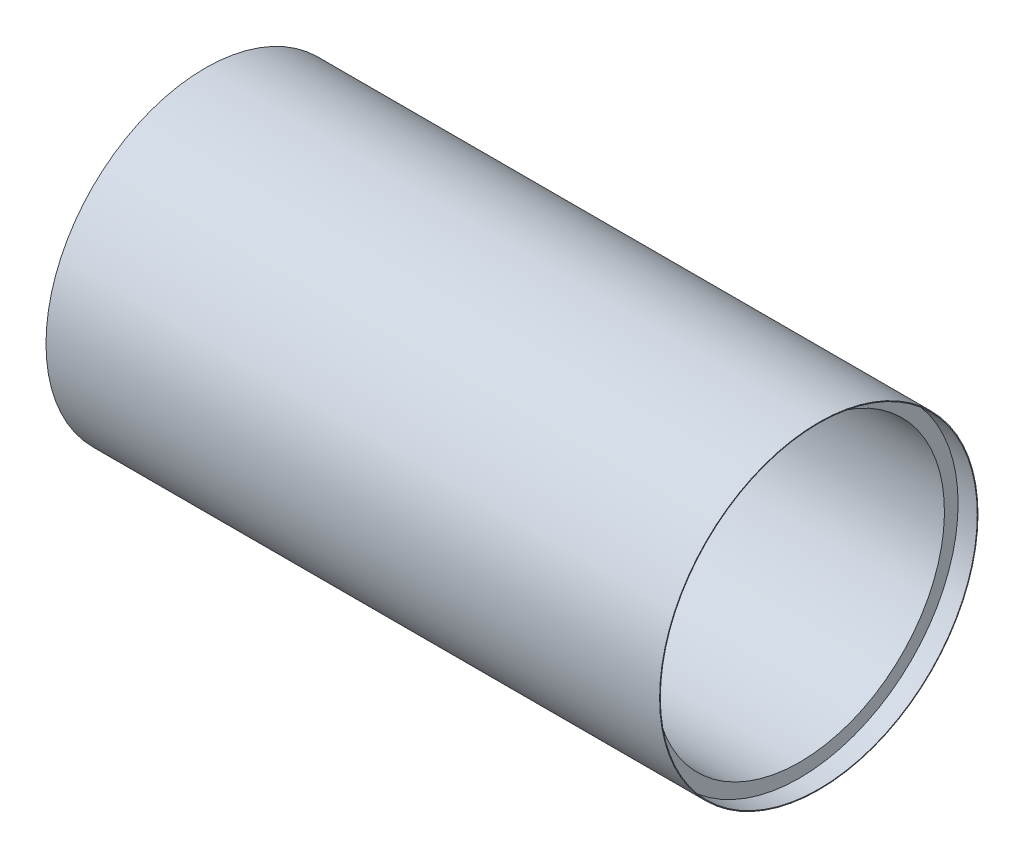
ISO-10303-21;
HEADER;
FILE_DESCRIPTION(('STEP AP214'),'2;1');
FILE_NAME('part.step','',(''),(''),'','','');
FILE_SCHEMA(('AUTOMOTIVE_DESIGN { 1 0 10303 214 1 1 1 1 }'));
ENDSEC;
DATA;
#1=APPLICATION_CONTEXT('core data for automotive mechanical design processes');
#2=APPLICATION_PROTOCOL_DEFINITION('international standard','automotive_design',2000,#1);
#3=PRODUCT_CONTEXT('',#1,'mechanical');
#4=PRODUCT('Part','Part','',(#3));
#5=PRODUCT_RELATED_PRODUCT_CATEGORY('part','',(#4));
#6=PRODUCT_DEFINITION_FORMATION('','',#4);
#7=PRODUCT_DEFINITION_CONTEXT('part definition',#1,'design');
#8=PRODUCT_DEFINITION('design','',#6,#7);
#9=PRODUCT_DEFINITION_SHAPE('','',#8);
#10=(LENGTH_UNIT() NAMED_UNIT(*) SI_UNIT(.MILLI.,.METRE.));
#11=(NAMED_UNIT(*) PLANE_ANGLE_UNIT() SI_UNIT($,.RADIAN.));
#12=(NAMED_UNIT(*) SI_UNIT($,.STERADIAN.) SOLID_ANGLE_UNIT());
#13=UNCERTAINTY_MEASURE_WITH_UNIT(LENGTH_MEASURE(1.E-05),#10,'distance_accuracy_value','');
#14=(GEOMETRIC_REPRESENTATION_CONTEXT(3) GLOBAL_UNCERTAINTY_ASSIGNED_CONTEXT((#13)) GLOBAL_UNIT_ASSIGNED_CONTEXT((#10,
#11,#12)) REPRESENTATION_CONTEXT('',''));
#15=CARTESIAN_POINT('',(0.,0.,0.));
#16=DIRECTION('',(0.,0.,1.));
#17=DIRECTION('',(1.,0.,0.));
#18=AXIS2_PLACEMENT_3D('',#15,#16,#17);
#19=CARTESIAN_POINT('',(0.,0.,0.));
#20=DIRECTION('',(-1.,0.,0.));
#21=DIRECTION('',(0.,-1.,0.));
#22=AXIS2_PLACEMENT_3D('',#19,#20,#21);
#23=CYLINDRICAL_SURFACE('',#22,84.3534);
#24=CARTESIAN_POINT('',(39.146309032124,0.,0.));
#25=DIRECTION('',(-1.,0.,0.));
#26=DIRECTION('',(0.,-1.,0.));
#27=AXIS2_PLACEMENT_3D('',#24,#25,#26);
#28=CIRCLE('',#27,84.3534);
#29=CARTESIAN_POINT('',(39.146309032124,-84.3534,0.));
#30=VERTEX_POINT('',#29);
#31=EDGE_CURVE('E10',#30,#30,#28,.T.);
#32=ORIENTED_EDGE('',*,*,#31,.F.);
#33=EDGE_LOOP('',(#32));
#34=FACE_BOUND('',#33,.T.);
#35=CARTESIAN_POINT('',(364.266309032124,0.,0.));
#36=DIRECTION('',(-1.,0.,0.));
#37=DIRECTION('',(0.,-1.,0.));
#38=AXIS2_PLACEMENT_3D('',#35,#36,#37);
#39=CIRCLE('',#38,84.3534);
#40=CARTESIAN_POINT('',(364.266309032124,-84.3534,0.));
#41=VERTEX_POINT('',#40);
#42=EDGE_CURVE('E69',#41,#41,#39,.T.);
#43=ORIENTED_EDGE('',*,*,#42,.T.);
#44=EDGE_LOOP('',(#43));
#45=FACE_BOUND('',#44,.T.);
#46=ADVANCED_FACE('F37',(#34,#45),#23,.T.);
#47=CARTESIAN_POINT('',(39.146309032124,0.,0.));
#48=DIRECTION('',(1.,0.,0.));
#49=DIRECTION('',(0.,1.,0.));
#50=AXIS2_PLACEMENT_3D('',#47,#48,#49);
#51=PLANE('',#50);
#52=CARTESIAN_POINT('',(39.146309032124,0.,0.));
#53=DIRECTION('',(-1.,0.,0.));
#54=DIRECTION('',(0.,-1.,0.));
#55=AXIS2_PLACEMENT_3D('',#52,#53,#54);
#56=CIRCLE('',#55,83.9724);
#57=CARTESIAN_POINT('',(39.146309032124,-83.9724,0.));
#58=VERTEX_POINT('',#57);
#59=EDGE_CURVE('E44',#58,#58,#56,.T.);
#60=ORIENTED_EDGE('',*,*,#59,.F.);
#61=EDGE_LOOP('',(#60));
#62=FACE_BOUND('',#61,.T.);
#63=ORIENTED_EDGE('',*,*,#31,.T.);
#64=EDGE_LOOP('',(#63));
#65=FACE_BOUND('',#64,.T.);
#66=ADVANCED_FACE('F106',(#62,#65),#51,.F.);
#67=CARTESIAN_POINT('',(0.,0.,0.));
#68=DIRECTION('',(-1.,0.,0.));
#69=DIRECTION('',(0.,-1.,0.));
#70=AXIS2_PLACEMENT_3D('',#67,#68,#69);
#71=CYLINDRICAL_SURFACE('',#70,83.9724);
#72=CARTESIAN_POINT('',(49.306309032124,0.,0.));
#73=DIRECTION('',(-1.,0.,0.));
#74=DIRECTION('',(0.,-1.,0.));
#75=AXIS2_PLACEMENT_3D('',#72,#73,#74);
#76=CIRCLE('',#75,83.9724);
#77=CARTESIAN_POINT('',(49.306309032124,-83.9724,0.));
#78=VERTEX_POINT('',#77);
#79=EDGE_CURVE('E49',#78,#78,#76,.T.);
#80=ORIENTED_EDGE('',*,*,#79,.F.);
#81=EDGE_LOOP('',(#80));
#82=FACE_BOUND('',#81,.T.);
#83=ORIENTED_EDGE('',*,*,#59,.T.);
#84=EDGE_LOOP('',(#83));
#85=FACE_BOUND('',#84,.T.);
#86=ADVANCED_FACE('F101',(#82,#85),#71,.F.);
#87=CARTESIAN_POINT('',(49.306309032124,0.,0.));
#88=DIRECTION('',(1.,0.,0.));
#89=DIRECTION('',(0.,1.,0.));
#90=AXIS2_PLACEMENT_3D('',#87,#88,#89);
#91=PLANE('',#90);
#92=CARTESIAN_POINT('',(49.306309032124,0.,0.));
#93=DIRECTION('',(-1.,0.,0.));
#94=DIRECTION('',(0.,-1.,0.));
#95=AXIS2_PLACEMENT_3D('',#92,#93,#94);
#96=CIRCLE('',#95,76.7334);
#97=CARTESIAN_POINT('',(49.306309032124,-76.7334,0.));
#98=VERTEX_POINT('',#97);
#99=EDGE_CURVE('E54',#98,#98,#96,.T.);
#100=ORIENTED_EDGE('',*,*,#99,.F.);
#101=EDGE_LOOP('',(#100));
#102=FACE_BOUND('',#101,.T.);
#103=ORIENTED_EDGE('',*,*,#79,.T.);
#104=EDGE_LOOP('',(#103));
#105=FACE_BOUND('',#104,.T.);
#106=ADVANCED_FACE('F95',(#102,#105),#91,.F.);
#107=CARTESIAN_POINT('',(0.,0.,0.));
#108=DIRECTION('',(-1.,0.,0.));
#109=DIRECTION('',(0.,-1.,0.));
#110=AXIS2_PLACEMENT_3D('',#107,#108,#109);
#111=CYLINDRICAL_SURFACE('',#110,76.7334);
#112=CARTESIAN_POINT('',(354.106309032124,0.,0.));
#113=DIRECTION('',(-1.,0.,0.));
#114=DIRECTION('',(0.,-1.,0.));
#115=AXIS2_PLACEMENT_3D('',#112,#113,#114);
#116=CIRCLE('',#115,76.7334);
#117=CARTESIAN_POINT('',(354.106309032124,-76.7334,0.));
#118=VERTEX_POINT('',#117);
#119=EDGE_CURVE('E60',#118,#118,#116,.T.);
#120=ORIENTED_EDGE('',*,*,#119,.F.);
#121=EDGE_LOOP('',(#120));
#122=FACE_BOUND('',#121,.T.);
#123=ORIENTED_EDGE('',*,*,#99,.T.);
#124=EDGE_LOOP('',(#123));
#125=FACE_BOUND('',#124,.T.);
#126=ADVANCED_FACE('F89',(#122,#125),#111,.F.);
#127=CARTESIAN_POINT('',(354.106309032124,0.,0.));
#128=DIRECTION('',(-1.,0.,0.));
#129=DIRECTION('',(0.,-1.,0.));
#130=AXIS2_PLACEMENT_3D('',#127,#128,#129);
#131=PLANE('',#130);
#132=CARTESIAN_POINT('',(354.106309032124,0.,0.));
#133=DIRECTION('',(-1.,0.,0.));
#134=DIRECTION('',(0.,-1.,0.));
#135=AXIS2_PLACEMENT_3D('',#132,#133,#134);
#136=CIRCLE('',#135,83.9724);
#137=CARTESIAN_POINT('',(354.106309032124,-83.9724,0.));
#138=VERTEX_POINT('',#137);
#139=EDGE_CURVE('E63',#138,#138,#136,.T.);
#140=ORIENTED_EDGE('',*,*,#139,.F.);
#141=EDGE_LOOP('',(#140));
#142=FACE_BOUND('',#141,.T.);
#143=ORIENTED_EDGE('',*,*,#119,.T.);
#144=EDGE_LOOP('',(#143));
#145=FACE_BOUND('',#144,.T.);
#146=ADVANCED_FACE('F83',(#142,#145),#131,.F.);
#147=CARTESIAN_POINT('',(0.,0.,0.));
#148=DIRECTION('',(-1.,0.,0.));
#149=DIRECTION('',(0.,-1.,0.));
#150=AXIS2_PLACEMENT_3D('',#147,#148,#149);
#151=CYLINDRICAL_SURFACE('',#150,83.9724);
#152=CARTESIAN_POINT('',(364.266309032124,0.,0.));
#153=DIRECTION('',(-1.,0.,0.));
#154=DIRECTION('',(0.,-1.,0.));
#155=AXIS2_PLACEMENT_3D('',#152,#153,#154);
#156=CIRCLE('',#155,83.9724);
#157=CARTESIAN_POINT('',(364.266309032124,-83.9724,0.));
#158=VERTEX_POINT('',#157);
#159=EDGE_CURVE('E66',#158,#158,#156,.T.);
#160=ORIENTED_EDGE('',*,*,#159,.F.);
#161=EDGE_LOOP('',(#160));
#162=FACE_BOUND('',#161,.T.);
#163=ORIENTED_EDGE('',*,*,#139,.T.);
#164=EDGE_LOOP('',(#163));
#165=FACE_BOUND('',#164,.T.);
#166=ADVANCED_FACE('F77',(#162,#165),#151,.F.);
#167=CARTESIAN_POINT('',(364.266309032124,0.,0.));
#168=DIRECTION('',(-1.,0.,0.));
#169=DIRECTION('',(0.,-1.,0.));
#170=AXIS2_PLACEMENT_3D('',#167,#168,#169);
#171=PLANE('',#170);
#172=ORIENTED_EDGE('',*,*,#42,.F.);
#173=EDGE_LOOP('',(#172));
#174=FACE_BOUND('',#173,.T.);
#175=ORIENTED_EDGE('',*,*,#159,.T.);
#176=EDGE_LOOP('',(#175));
#177=FACE_BOUND('',#176,.T.);
#178=ADVANCED_FACE('F74',(#174,#177),#171,.F.);
#179=CLOSED_SHELL('',(#46,#66,#86,#106,#126,#146,#166,#178));
#180=MANIFOLD_SOLID_BREP('B2',#179);
#181=ADVANCED_BREP_SHAPE_REPRESENTATION('',(#18,#180),#14);
#182=SHAPE_DEFINITION_REPRESENTATION(#9,#181);
ENDSEC;
END-ISO-10303-21;
